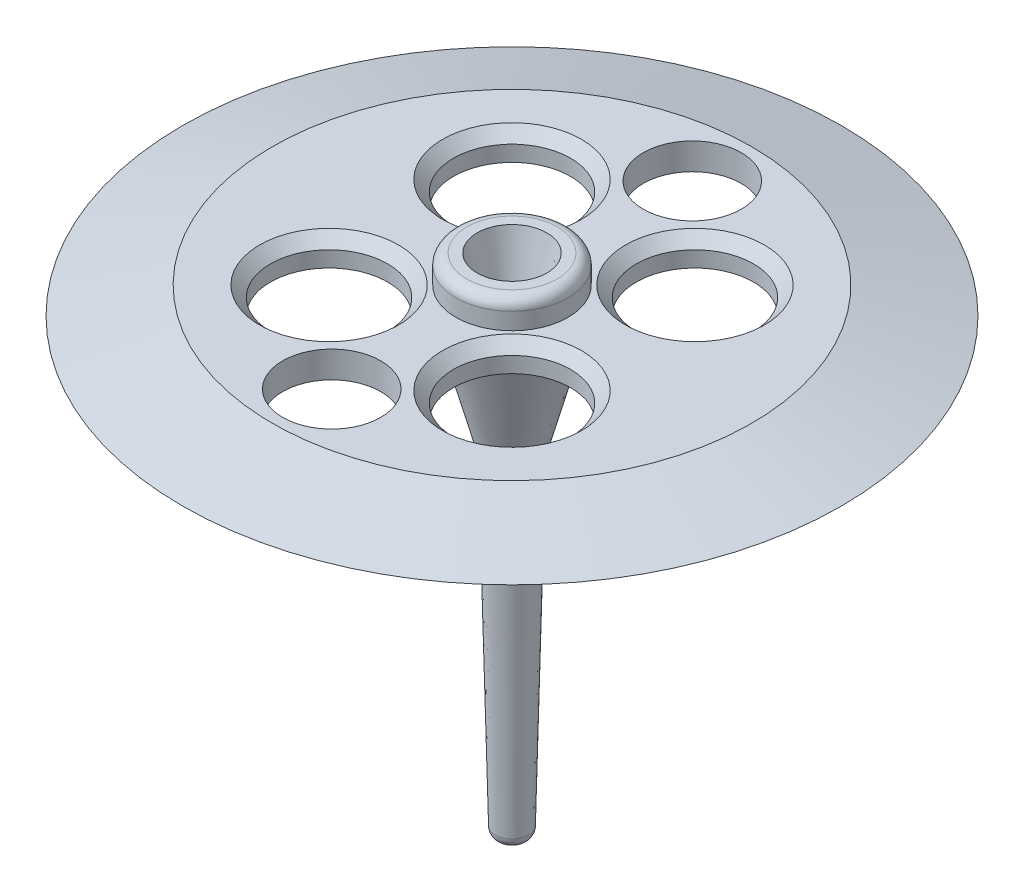
ISO-10303-21;
HEADER;
FILE_DESCRIPTION(('STEP AP214'),'2;1');
FILE_NAME('part.step','',(''),(''),'','','');
FILE_SCHEMA(('AUTOMOTIVE_DESIGN { 1 0 10303 214 1 1 1 1 }'));
ENDSEC;
DATA;
#1=APPLICATION_CONTEXT('core data for automotive mechanical design processes');
#2=APPLICATION_PROTOCOL_DEFINITION('international standard','automotive_design',2000,#1);
#3=PRODUCT_CONTEXT('',#1,'mechanical');
#4=PRODUCT('Part','Part','',(#3));
#5=PRODUCT_RELATED_PRODUCT_CATEGORY('part','',(#4));
#6=PRODUCT_DEFINITION_FORMATION('','',#4);
#7=PRODUCT_DEFINITION_CONTEXT('part definition',#1,'design');
#8=PRODUCT_DEFINITION('design','',#6,#7);
#9=PRODUCT_DEFINITION_SHAPE('','',#8);
#10=(LENGTH_UNIT() NAMED_UNIT(*) SI_UNIT(.MILLI.,.METRE.));
#11=(NAMED_UNIT(*) PLANE_ANGLE_UNIT() SI_UNIT($,.RADIAN.));
#12=(NAMED_UNIT(*) SI_UNIT($,.STERADIAN.) SOLID_ANGLE_UNIT());
#13=UNCERTAINTY_MEASURE_WITH_UNIT(LENGTH_MEASURE(1.E-05),#10,'distance_accuracy_value','');
#14=(GEOMETRIC_REPRESENTATION_CONTEXT(3) GLOBAL_UNCERTAINTY_ASSIGNED_CONTEXT((#13)) GLOBAL_UNIT_ASSIGNED_CONTEXT((#10,
#11,#12)) REPRESENTATION_CONTEXT('',''));
#15=CARTESIAN_POINT('',(0.,0.,0.));
#16=DIRECTION('',(0.,0.,1.));
#17=DIRECTION('',(1.,0.,0.));
#18=AXIS2_PLACEMENT_3D('',#15,#16,#17);
#19=CARTESIAN_POINT('',(0.,0.,0.));
#20=DIRECTION('',(0.,1.,0.));
#21=DIRECTION('',(0.,0.,1.));
#22=AXIS2_PLACEMENT_3D('',#19,#20,#21);
#23=CONICAL_SURFACE('',#22,5.15,0.262016417954227);
#24=CARTESIAN_POINT('',(0.,-10.8839918967392,0.));
#25=DIRECTION('',(0.,-1.,0.));
#26=DIRECTION('',(0.,0.,-1.));
#27=AXIS2_PLACEMENT_3D('',#24,#25,#26);
#28=CIRCLE('',#27,2.2311112640563);
#29=CARTESIAN_POINT('',(0.,-10.8839918967392,-2.2311112640563));
#30=VERTEX_POINT('',#29);
#31=EDGE_CURVE('E62',#30,#30,#28,.T.);
#32=ORIENTED_EDGE('',*,*,#31,.F.);
#33=EDGE_LOOP('',(#32));
#34=FACE_BOUND('',#33,.T.);
#35=CARTESIAN_POINT('',(0.,0.,0.));
#36=DIRECTION('',(0.,-1.,0.));
#37=DIRECTION('',(0.,0.,-1.));
#38=AXIS2_PLACEMENT_3D('',#35,#36,#37);
#39=CIRCLE('',#38,5.15);
#40=CARTESIAN_POINT('',(0.,0.,-5.15));
#41=VERTEX_POINT('',#40);
#42=EDGE_CURVE('E83',#41,#41,#39,.T.);
#43=ORIENTED_EDGE('',*,*,#42,.T.);
#44=EDGE_LOOP('',(#43));
#45=FACE_BOUND('',#44,.T.);
#46=ADVANCED_FACE('F30',(#34,#45),#23,.T.);
#47=CARTESIAN_POINT('',(0.,-11.1430205707765,0.));
#48=DIRECTION('',(0.,-1.,0.));
#49=DIRECTION('',(0.,0.,-1.));
#50=AXIS2_PLACEMENT_3D('',#47,#48,#49);
#51=TOROIDAL_SURFACE('',#50,3.19698089605975,1.);
#52=CARTESIAN_POINT('',(0.,-11.1200757932763,0.));
#53=DIRECTION('',(0.,-1.,0.));
#54=DIRECTION('',(0.,0.,-1.));
#55=AXIS2_PLACEMENT_3D('',#52,#53,#54);
#56=CIRCLE('',#55,2.19724416212153);
#57=CARTESIAN_POINT('',(0.,-11.1200757932763,-2.19724416212153));
#58=VERTEX_POINT('',#57);
#59=EDGE_CURVE('E86',#58,#58,#56,.T.);
#60=ORIENTED_EDGE('',*,*,#59,.F.);
#61=EDGE_LOOP('',(#60));
#62=FACE_BOUND('',#61,.T.);
#63=ORIENTED_EDGE('',*,*,#31,.T.);
#64=EDGE_LOOP('',(#63));
#65=FACE_BOUND('',#64,.T.);
#66=ADVANCED_FACE('F173',(#62,#65),#51,.F.);
#67=CARTESIAN_POINT('',(0.,-11.1200757932763,0.));
#68=DIRECTION('',(0.,1.,0.));
#69=DIRECTION('',(0.,0.,1.));
#70=AXIS2_PLACEMENT_3D('',#67,#68,#69);
#71=CONICAL_SURFACE('',#70,2.19724416212153,0.0229467912393531);
#72=CARTESIAN_POINT('',(0.,-40.5229447775002,0.));
#73=DIRECTION('',(0.,-1.,0.));
#74=DIRECTION('',(0.,0.,-1.));
#75=AXIS2_PLACEMENT_3D('',#72,#73,#74);
#76=CIRCLE('',#75,1.5224242182213);
#77=CARTESIAN_POINT('',(0.,-40.5229447775002,-1.5224242182213));
#78=VERTEX_POINT('',#77);
#79=EDGE_CURVE('E89',#78,#78,#76,.T.);
#80=ORIENTED_EDGE('',*,*,#79,.F.);
#81=EDGE_LOOP('',(#80));
#82=FACE_BOUND('',#81,.T.);
#83=ORIENTED_EDGE('',*,*,#59,.T.);
#84=EDGE_LOOP('',(#83));
#85=FACE_BOUND('',#84,.T.);
#86=ADVANCED_FACE('F179',(#82,#85),#71,.T.);
#87=CARTESIAN_POINT('',(0.,-40.5,0.));
#88=DIRECTION('',(0.,-1.,0.));
#89=DIRECTION('',(0.,0.,-1.));
#90=AXIS2_PLACEMENT_3D('',#87,#88,#89);
#91=DEGENERATE_TOROIDAL_SURFACE('',#90,0.522687484283084,0.999999999999997,.T.);
#92=CARTESIAN_POINT('',(0.,-41.5,0.));
#93=DIRECTION('',(0.,-1.,0.));
#94=DIRECTION('',(0.,0.,-1.));
#95=AXIS2_PLACEMENT_3D('',#92,#93,#94);
#96=CIRCLE('',#95,0.522687484283084);
#97=CARTESIAN_POINT('',(0.,-41.5,-0.522687484283084));
#98=VERTEX_POINT('',#97);
#99=EDGE_CURVE('E92',#98,#98,#96,.T.);
#100=ORIENTED_EDGE('',*,*,#99,.F.);
#101=EDGE_LOOP('',(#100));
#102=FACE_BOUND('',#101,.T.);
#103=ORIENTED_EDGE('',*,*,#79,.T.);
#104=EDGE_LOOP('',(#103));
#105=FACE_BOUND('',#104,.T.);
#106=ADVANCED_FACE('F169',(#102,#105),#91,.T.);
#107=CARTESIAN_POINT('',(-0.522687484283084,-41.5,0.));
#108=DIRECTION('',(0.,1.,0.));
#109=DIRECTION('',(0.,0.,1.));
#110=AXIS2_PLACEMENT_3D('',#107,#108,#109);
#111=PLANE('',#110);
#112=ORIENTED_EDGE('',*,*,#99,.T.);
#113=EDGE_LOOP('',(#112));
#114=FACE_BOUND('',#113,.T.);
#115=ADVANCED_FACE('F164',(#114),#111,.F.);
#116=CARTESIAN_POINT('',(-2.,0.,0.));
#117=DIRECTION('',(0.,-1.,0.));
#118=DIRECTION('',(0.,0.,-1.));
#119=AXIS2_PLACEMENT_3D('',#116,#117,#118);
#120=PLANE('',#119);
#121=CARTESIAN_POINT('',(0.,0.,0.));
#122=DIRECTION('',(0.,-1.,0.));
#123=DIRECTION('',(0.,0.,-1.));
#124=AXIS2_PLACEMENT_3D('',#121,#122,#123);
#125=CIRCLE('',#124,2.);
#126=CARTESIAN_POINT('',(0.,0.,-2.));
#127=VERTEX_POINT('',#126);
#128=EDGE_CURVE('E95',#127,#127,#125,.T.);
#129=ORIENTED_EDGE('',*,*,#128,.F.);
#130=EDGE_LOOP('',(#129));
#131=FACE_BOUND('',#130,.T.);
#132=ADVANCED_FACE('F159',(#131),#120,.F.);
#133=CARTESIAN_POINT('',(0.,0.,0.));
#134=DIRECTION('',(0.,1.,0.));
#135=DIRECTION('',(0.,0.,1.));
#136=AXIS2_PLACEMENT_3D('',#133,#134,#135);
#137=CONICAL_SURFACE('',#136,2.,0.234973967604444);
#138=CARTESIAN_POINT('',(0.,5.,0.));
#139=DIRECTION('',(0.,-1.,0.));
#140=DIRECTION('',(0.,0.,-1.));
#141=AXIS2_PLACEMENT_3D('',#138,#139,#140);
#142=CIRCLE('',#141,3.19698089605975);
#143=CARTESIAN_POINT('',(0.,5.,-3.19698089605975));
#144=VERTEX_POINT('',#143);
#145=EDGE_CURVE('E98',#144,#144,#142,.T.);
#146=ORIENTED_EDGE('',*,*,#145,.F.);
#147=EDGE_LOOP('',(#146));
#148=FACE_BOUND('',#147,.T.);
#149=ORIENTED_EDGE('',*,*,#128,.T.);
#150=EDGE_LOOP('',(#149));
#151=FACE_BOUND('',#150,.T.);
#152=ADVANCED_FACE('F153',(#148,#151),#137,.F.);
#153=CARTESIAN_POINT('',(-4.15,5.,0.));
#154=DIRECTION('',(0.,-1.,0.));
#155=DIRECTION('',(0.,0.,-1.));
#156=AXIS2_PLACEMENT_3D('',#153,#154,#155);
#157=PLANE('',#156);
#158=CARTESIAN_POINT('',(0.,5.,0.));
#159=DIRECTION('',(0.,-1.,0.));
#160=DIRECTION('',(0.,0.,-1.));
#161=AXIS2_PLACEMENT_3D('',#158,#159,#160);
#162=CIRCLE('',#161,4.15);
#163=CARTESIAN_POINT('',(0.,5.,-4.15));
#164=VERTEX_POINT('',#163);
#165=EDGE_CURVE('E101',#164,#164,#162,.T.);
#166=ORIENTED_EDGE('',*,*,#165,.F.);
#167=EDGE_LOOP('',(#166));
#168=FACE_BOUND('',#167,.T.);
#169=ORIENTED_EDGE('',*,*,#145,.T.);
#170=EDGE_LOOP('',(#169));
#171=FACE_BOUND('',#170,.T.);
#172=ADVANCED_FACE('F147',(#168,#171),#157,.F.);
#173=CARTESIAN_POINT('',(0.,4.,0.));
#174=DIRECTION('',(0.,-1.,0.));
#175=DIRECTION('',(0.,0.,-1.));
#176=AXIS2_PLACEMENT_3D('',#173,#174,#175);
#177=TOROIDAL_SURFACE('',#176,4.15,1.);
#178=CARTESIAN_POINT('',(0.,4.,0.));
#179=DIRECTION('',(0.,-1.,0.));
#180=DIRECTION('',(0.,0.,-1.));
#181=AXIS2_PLACEMENT_3D('',#178,#179,#180);
#182=CIRCLE('',#181,5.15);
#183=CARTESIAN_POINT('',(0.,4.,-5.15));
#184=VERTEX_POINT('',#183);
#185=EDGE_CURVE('E104',#184,#184,#182,.T.);
#186=ORIENTED_EDGE('',*,*,#185,.F.);
#187=EDGE_LOOP('',(#186));
#188=FACE_BOUND('',#187,.T.);
#189=ORIENTED_EDGE('',*,*,#165,.T.);
#190=EDGE_LOOP('',(#189));
#191=FACE_BOUND('',#190,.T.);
#192=ADVANCED_FACE('F141',(#188,#191),#177,.T.);
#193=CARTESIAN_POINT('',(0.,0.,0.));
#194=DIRECTION('',(0.,-1.,0.));
#195=DIRECTION('',(0.,0.,-1.));
#196=AXIS2_PLACEMENT_3D('',#193,#194,#195);
#197=CYLINDRICAL_SURFACE('',#196,5.15);
#198=CARTESIAN_POINT('',(0.,2.45,0.));
#199=DIRECTION('',(0.,-1.,0.));
#200=DIRECTION('',(0.,0.,-1.));
#201=AXIS2_PLACEMENT_3D('',#198,#199,#200);
#202=CIRCLE('',#201,5.15);
#203=CARTESIAN_POINT('',(0.,2.45,-5.15));
#204=VERTEX_POINT('',#203);
#205=EDGE_CURVE('E107',#204,#204,#202,.T.);
#206=ORIENTED_EDGE('',*,*,#205,.F.);
#207=EDGE_LOOP('',(#206));
#208=FACE_BOUND('',#207,.T.);
#209=ORIENTED_EDGE('',*,*,#185,.T.);
#210=EDGE_LOOP('',(#209));
#211=FACE_BOUND('',#210,.T.);
#212=ADVANCED_FACE('F130',(#208,#211),#197,.T.);
#213=CARTESIAN_POINT('',(-22.,2.45,0.));
#214=DIRECTION('',(0.,-1.,0.));
#215=DIRECTION('',(0.,0.,-1.));
#216=AXIS2_PLACEMENT_3D('',#213,#214,#215);
#217=PLANE('',#216);
#218=CARTESIAN_POINT('',(8.39689302659027,2.45,-8.39689302659024));
#219=DIRECTION('',(0.,-1.,0.));
#220=DIRECTION('',(0.,0.,-1.));
#221=AXIS2_PLACEMENT_3D('',#218,#219,#220);
#222=CIRCLE('',#221,6.375);
#223=CARTESIAN_POINT('',(8.39689302659027,2.45,-14.7718930265902));
#224=VERTEX_POINT('',#223);
#225=EDGE_CURVE('E45',#224,#224,#222,.T.);
#226=ORIENTED_EDGE('',*,*,#225,.T.);
#227=EDGE_LOOP('',(#226));
#228=FACE_BOUND('',#227,.T.);
#229=CARTESIAN_POINT('',(8.39689302659027,2.45,8.39689302659024));
#230=DIRECTION('',(0.,-1.,0.));
#231=DIRECTION('',(0.,0.,-1.));
#232=AXIS2_PLACEMENT_3D('',#229,#230,#231);
#233=CIRCLE('',#232,6.375);
#234=CARTESIAN_POINT('',(8.39689302659027,2.45,2.02189302659024));
#235=VERTEX_POINT('',#234);
#236=EDGE_CURVE('E50',#235,#235,#233,.T.);
#237=ORIENTED_EDGE('',*,*,#236,.T.);
#238=EDGE_LOOP('',(#237));
#239=FACE_BOUND('',#238,.T.);
#240=CARTESIAN_POINT('',(-8.39689302659027,2.45,8.39689302659024));
#241=DIRECTION('',(0.,-1.,0.));
#242=DIRECTION('',(0.,0.,-1.));
#243=AXIS2_PLACEMENT_3D('',#240,#241,#242);
#244=CIRCLE('',#243,6.375);
#245=CARTESIAN_POINT('',(-8.39689302659027,2.45,2.02189302659024));
#246=VERTEX_POINT('',#245);
#247=EDGE_CURVE('E53',#246,#246,#244,.T.);
#248=ORIENTED_EDGE('',*,*,#247,.T.);
#249=EDGE_LOOP('',(#248));
#250=FACE_BOUND('',#249,.T.);
#251=CARTESIAN_POINT('',(-8.39689302659027,2.45,-8.39689302659024));
#252=DIRECTION('',(0.,-1.,0.));
#253=DIRECTION('',(0.,0.,-1.));
#254=AXIS2_PLACEMENT_3D('',#251,#252,#253);
#255=CIRCLE('',#254,6.375);
#256=CARTESIAN_POINT('',(-8.39689302659027,2.45,-14.7718930265902));
#257=VERTEX_POINT('',#256);
#258=EDGE_CURVE('E56',#257,#257,#255,.T.);
#259=ORIENTED_EDGE('',*,*,#258,.T.);
#260=EDGE_LOOP('',(#259));
#261=FACE_BOUND('',#260,.T.);
#262=CARTESIAN_POINT('',(0.,2.45,16.55));
#263=DIRECTION('',(0.,1.,0.));
#264=DIRECTION('',(0.,0.,-1.));
#265=AXIS2_PLACEMENT_3D('',#262,#263,#264);
#266=CIRCLE('',#265,4.5);
#267=CARTESIAN_POINT('',(0.,2.45,12.05));
#268=VERTEX_POINT('',#267);
#269=EDGE_CURVE('E66',#268,#268,#266,.T.);
#270=ORIENTED_EDGE('',*,*,#269,.F.);
#271=EDGE_LOOP('',(#270));
#272=FACE_BOUND('',#271,.T.);
#273=CARTESIAN_POINT('',(0.,2.45,-16.55));
#274=DIRECTION('',(0.,1.,0.));
#275=DIRECTION('',(0.,0.,1.));
#276=AXIS2_PLACEMENT_3D('',#273,#274,#275);
#277=CIRCLE('',#276,4.5);
#278=CARTESIAN_POINT('',(0.,2.45,-12.05));
#279=VERTEX_POINT('',#278);
#280=EDGE_CURVE('E70',#279,#279,#277,.T.);
#281=ORIENTED_EDGE('',*,*,#280,.F.);
#282=EDGE_LOOP('',(#281));
#283=FACE_BOUND('',#282,.T.);
#284=CARTESIAN_POINT('',(0.,2.45,0.));
#285=DIRECTION('',(0.,-1.,0.));
#286=DIRECTION('',(0.,0.,-1.));
#287=AXIS2_PLACEMENT_3D('',#284,#285,#286);
#288=CIRCLE('',#287,22.);
#289=CARTESIAN_POINT('',(0.,2.45,-22.));
#290=VERTEX_POINT('',#289);
#291=EDGE_CURVE('E110',#290,#290,#288,.T.);
#292=ORIENTED_EDGE('',*,*,#291,.F.);
#293=EDGE_LOOP('',(#292));
#294=FACE_BOUND('',#293,.T.);
#295=ORIENTED_EDGE('',*,*,#205,.T.);
#296=EDGE_LOOP('',(#295));
#297=FACE_BOUND('',#296,.T.);
#298=ADVANCED_FACE('F126',(#228,#239,#250,#261,#272,#283,#294,#297),#217,.F.);
#299=CARTESIAN_POINT('',(0.,2.45,0.));
#300=DIRECTION('',(0.,-1.,0.));
#301=DIRECTION('',(0.,0.,-1.));
#302=AXIS2_PLACEMENT_3D('',#299,#300,#301);
#303=CONICAL_SURFACE('',#302,22.,1.28212194027307);
#304=CARTESIAN_POINT('',(0.,0.,0.));
#305=DIRECTION('',(0.,-1.,0.));
#306=DIRECTION('',(0.,0.,-1.));
#307=AXIS2_PLACEMENT_3D('',#304,#305,#306);
#308=CIRCLE('',#307,30.25);
#309=CARTESIAN_POINT('',(0.,0.,-30.25));
#310=VERTEX_POINT('',#309);
#311=EDGE_CURVE('E113',#310,#310,#308,.T.);
#312=ORIENTED_EDGE('',*,*,#311,.F.);
#313=EDGE_LOOP('',(#312));
#314=FACE_BOUND('',#313,.T.);
#315=ORIENTED_EDGE('',*,*,#291,.T.);
#316=EDGE_LOOP('',(#315));
#317=FACE_BOUND('',#316,.T.);
#318=ADVANCED_FACE('F129',(#314,#317),#303,.T.);
#319=CARTESIAN_POINT('',(-5.15,0.,0.));
#320=DIRECTION('',(0.,1.,0.));
#321=DIRECTION('',(0.,0.,1.));
#322=AXIS2_PLACEMENT_3D('',#319,#320,#321);
#323=PLANE('',#322);
#324=CARTESIAN_POINT('',(-8.39689302659027,0.,8.39689302659024));
#325=DIRECTION('',(0.,1.,0.));
#326=DIRECTION('',(0.,0.,1.));
#327=AXIS2_PLACEMENT_3D('',#324,#325,#326);
#328=CIRCLE('',#327,5.375);
#329=CARTESIAN_POINT('',(-8.39689302659027,0.,13.7718930265902));
#330=VERTEX_POINT('',#329);
#331=EDGE_CURVE('E63',#330,#330,#328,.T.);
#332=ORIENTED_EDGE('',*,*,#331,.T.);
#333=EDGE_LOOP('',(#332));
#334=FACE_BOUND('',#333,.T.);
#335=CARTESIAN_POINT('',(0.,0.,16.55));
#336=DIRECTION('',(0.,1.,0.));
#337=DIRECTION('',(0.,0.,1.));
#338=AXIS2_PLACEMENT_3D('',#335,#336,#337);
#339=CIRCLE('',#338,4.5);
#340=CARTESIAN_POINT('',(0.,0.,21.05));
#341=VERTEX_POINT('',#340);
#342=EDGE_CURVE('E67',#341,#341,#339,.T.);
#343=ORIENTED_EDGE('',*,*,#342,.T.);
#344=EDGE_LOOP('',(#343));
#345=FACE_BOUND('',#344,.T.);
#346=CARTESIAN_POINT('',(0.,0.,-16.55));
#347=DIRECTION('',(0.,1.,0.));
#348=DIRECTION('',(0.,0.,1.));
#349=AXIS2_PLACEMENT_3D('',#346,#347,#348);
#350=CIRCLE('',#349,4.5);
#351=CARTESIAN_POINT('',(0.,0.,-12.05));
#352=VERTEX_POINT('',#351);
#353=EDGE_CURVE('E71',#352,#352,#350,.T.);
#354=ORIENTED_EDGE('',*,*,#353,.T.);
#355=EDGE_LOOP('',(#354));
#356=FACE_BOUND('',#355,.T.);
#357=CARTESIAN_POINT('',(8.39689302659027,0.,-8.39689302659024));
#358=DIRECTION('',(0.,1.,0.));
#359=DIRECTION('',(0.,0.,1.));
#360=AXIS2_PLACEMENT_3D('',#357,#358,#359);
#361=CIRCLE('',#360,5.375);
#362=CARTESIAN_POINT('',(8.39689302659027,0.,-3.02189302659024));
#363=VERTEX_POINT('',#362);
#364=EDGE_CURVE('E74',#363,#363,#361,.T.);
#365=ORIENTED_EDGE('',*,*,#364,.T.);
#366=EDGE_LOOP('',(#365));
#367=FACE_BOUND('',#366,.T.);
#368=CARTESIAN_POINT('',(8.39689302659027,0.,8.39689302659024));
#369=DIRECTION('',(0.,1.,0.));
#370=DIRECTION('',(0.,0.,1.));
#371=AXIS2_PLACEMENT_3D('',#368,#369,#370);
#372=CIRCLE('',#371,5.375);
#373=CARTESIAN_POINT('',(8.39689302659027,0.,13.7718930265902));
#374=VERTEX_POINT('',#373);
#375=EDGE_CURVE('E77',#374,#374,#372,.T.);
#376=ORIENTED_EDGE('',*,*,#375,.T.);
#377=EDGE_LOOP('',(#376));
#378=FACE_BOUND('',#377,.T.);
#379=CARTESIAN_POINT('',(-8.39689302659027,0.,-8.39689302659024));
#380=DIRECTION('',(0.,1.,0.));
#381=DIRECTION('',(0.,0.,1.));
#382=AXIS2_PLACEMENT_3D('',#379,#380,#381);
#383=CIRCLE('',#382,5.375);
#384=CARTESIAN_POINT('',(-8.39689302659027,0.,-3.02189302659024));
#385=VERTEX_POINT('',#384);
#386=EDGE_CURVE('E80',#385,#385,#383,.T.);
#387=ORIENTED_EDGE('',*,*,#386,.T.);
#388=EDGE_LOOP('',(#387));
#389=FACE_BOUND('',#388,.T.);
#390=ORIENTED_EDGE('',*,*,#42,.F.);
#391=EDGE_LOOP('',(#390));
#392=FACE_BOUND('',#391,.T.);
#393=ORIENTED_EDGE('',*,*,#311,.T.);
#394=EDGE_LOOP('',(#393));
#395=FACE_BOUND('',#394,.T.);
#396=ADVANCED_FACE('F268',(#334,#345,#356,#367,#378,#389,#392,#395),#323,.F.);
#397=CARTESIAN_POINT('',(-8.39689302659027,-41.5,-8.39689302659024));
#398=DIRECTION('',(0.,1.,0.));
#399=DIRECTION('',(0.,0.,1.));
#400=AXIS2_PLACEMENT_3D('',#397,#398,#399);
#401=CYLINDRICAL_SURFACE('',#400,5.375);
#402=CARTESIAN_POINT('',(-8.39689302659027,1.45,-8.39689302659024));
#403=DIRECTION('',(0.,-1.,0.));
#404=DIRECTION('',(0.,0.,-1.));
#405=AXIS2_PLACEMENT_3D('',#402,#403,#404);
#406=CIRCLE('',#405,5.375);
#407=CARTESIAN_POINT('',(-8.39689302659027,1.45,-13.7718930265902));
#408=VERTEX_POINT('',#407);
#409=EDGE_CURVE('E10',#408,#408,#406,.F.);
#410=ORIENTED_EDGE('',*,*,#409,.T.);
#411=EDGE_LOOP('',(#410));
#412=FACE_BOUND('',#411,.T.);
#413=ORIENTED_EDGE('',*,*,#386,.F.);
#414=EDGE_LOOP('',(#413));
#415=FACE_BOUND('',#414,.T.);
#416=ADVANCED_FACE('F258',(#412,#415),#401,.F.);
#417=CARTESIAN_POINT('',(8.39689302659027,-41.5,8.39689302659024));
#418=DIRECTION('',(0.,1.,0.));
#419=DIRECTION('',(0.,0.,1.));
#420=AXIS2_PLACEMENT_3D('',#417,#418,#419);
#421=CYLINDRICAL_SURFACE('',#420,5.375);
#422=CARTESIAN_POINT('',(8.39689302659027,1.45,8.39689302659024));
#423=DIRECTION('',(0.,-1.,0.));
#424=DIRECTION('',(0.,0.,-1.));
#425=AXIS2_PLACEMENT_3D('',#422,#423,#424);
#426=CIRCLE('',#425,5.375);
#427=CARTESIAN_POINT('',(8.39689302659027,1.45,3.02189302659024));
#428=VERTEX_POINT('',#427);
#429=EDGE_CURVE('E41',#428,#428,#426,.F.);
#430=ORIENTED_EDGE('',*,*,#429,.T.);
#431=EDGE_LOOP('',(#430));
#432=FACE_BOUND('',#431,.T.);
#433=ORIENTED_EDGE('',*,*,#375,.F.);
#434=EDGE_LOOP('',(#433));
#435=FACE_BOUND('',#434,.T.);
#436=ADVANCED_FACE('F246',(#432,#435),#421,.F.);
#437=CARTESIAN_POINT('',(8.39689302659027,-41.5,-8.39689302659024));
#438=DIRECTION('',(0.,1.,0.));
#439=DIRECTION('',(0.,0.,1.));
#440=AXIS2_PLACEMENT_3D('',#437,#438,#439);
#441=CYLINDRICAL_SURFACE('',#440,5.375);
#442=CARTESIAN_POINT('',(8.39689302659027,1.45,-8.39689302659024));
#443=DIRECTION('',(0.,-1.,0.));
#444=DIRECTION('',(0.,0.,-1.));
#445=AXIS2_PLACEMENT_3D('',#442,#443,#444);
#446=CIRCLE('',#445,5.375);
#447=CARTESIAN_POINT('',(8.39689302659027,1.45,-13.7718930265902));
#448=VERTEX_POINT('',#447);
#449=EDGE_CURVE('E59',#448,#448,#446,.F.);
#450=ORIENTED_EDGE('',*,*,#449,.T.);
#451=EDGE_LOOP('',(#450));
#452=FACE_BOUND('',#451,.T.);
#453=ORIENTED_EDGE('',*,*,#364,.F.);
#454=EDGE_LOOP('',(#453));
#455=FACE_BOUND('',#454,.T.);
#456=ADVANCED_FACE('F240',(#452,#455),#441,.F.);
#457=CARTESIAN_POINT('',(0.,-41.5,-16.55));
#458=DIRECTION('',(0.,1.,0.));
#459=DIRECTION('',(0.,0.,1.));
#460=AXIS2_PLACEMENT_3D('',#457,#458,#459);
#461=CYLINDRICAL_SURFACE('',#460,4.5);
#462=ORIENTED_EDGE('',*,*,#280,.T.);
#463=EDGE_LOOP('',(#462));
#464=FACE_BOUND('',#463,.T.);
#465=ORIENTED_EDGE('',*,*,#353,.F.);
#466=EDGE_LOOP('',(#465));
#467=FACE_BOUND('',#466,.T.);
#468=ADVANCED_FACE('F245',(#464,#467),#461,.F.);
#469=CARTESIAN_POINT('',(0.,-41.5,16.55));
#470=DIRECTION('',(0.,1.,0.));
#471=DIRECTION('',(0.,0.,1.));
#472=AXIS2_PLACEMENT_3D('',#469,#470,#471);
#473=CYLINDRICAL_SURFACE('',#472,4.5);
#474=ORIENTED_EDGE('',*,*,#269,.T.);
#475=EDGE_LOOP('',(#474));
#476=FACE_BOUND('',#475,.T.);
#477=ORIENTED_EDGE('',*,*,#342,.F.);
#478=EDGE_LOOP('',(#477));
#479=FACE_BOUND('',#478,.T.);
#480=ADVANCED_FACE('F123',(#476,#479),#473,.F.);
#481=CARTESIAN_POINT('',(-8.39689302659027,-41.5,8.39689302659024));
#482=DIRECTION('',(0.,1.,0.));
#483=DIRECTION('',(0.,0.,1.));
#484=AXIS2_PLACEMENT_3D('',#481,#482,#483);
#485=CYLINDRICAL_SURFACE('',#484,5.375);
#486=CARTESIAN_POINT('',(-8.39689302659027,1.45,8.39689302659024));
#487=DIRECTION('',(0.,-1.,0.));
#488=DIRECTION('',(0.,0.,-1.));
#489=AXIS2_PLACEMENT_3D('',#486,#487,#488);
#490=CIRCLE('',#489,5.375);
#491=CARTESIAN_POINT('',(-8.39689302659027,1.45,3.02189302659024));
#492=VERTEX_POINT('',#491);
#493=EDGE_CURVE('E37',#492,#492,#490,.F.);
#494=ORIENTED_EDGE('',*,*,#493,.T.);
#495=EDGE_LOOP('',(#494));
#496=FACE_BOUND('',#495,.T.);
#497=ORIENTED_EDGE('',*,*,#331,.F.);
#498=EDGE_LOOP('',(#497));
#499=FACE_BOUND('',#498,.T.);
#500=ADVANCED_FACE('F190',(#496,#499),#485,.F.);
#501=CARTESIAN_POINT('',(8.39689302659027,1.45,-8.39689302659024));
#502=DIRECTION('',(0.,1.,0.));
#503=DIRECTION('',(0.,0.,1.));
#504=AXIS2_PLACEMENT_3D('',#501,#502,#503);
#505=CONICAL_SURFACE('',#504,5.375,0.785398163397451);
#506=ORIENTED_EDGE('',*,*,#225,.F.);
#507=EDGE_LOOP('',(#506));
#508=FACE_BOUND('',#507,.T.);
#509=ORIENTED_EDGE('',*,*,#449,.F.);
#510=EDGE_LOOP('',(#509));
#511=FACE_BOUND('',#510,.T.);
#512=ADVANCED_FACE('F186',(#508,#511),#505,.F.);
#513=CARTESIAN_POINT('',(8.39689302659027,1.45,8.39689302659024));
#514=DIRECTION('',(0.,1.,0.));
#515=DIRECTION('',(0.,0.,1.));
#516=AXIS2_PLACEMENT_3D('',#513,#514,#515);
#517=CONICAL_SURFACE('',#516,5.375,0.785398163397451);
#518=ORIENTED_EDGE('',*,*,#236,.F.);
#519=EDGE_LOOP('',(#518));
#520=FACE_BOUND('',#519,.T.);
#521=ORIENTED_EDGE('',*,*,#429,.F.);
#522=EDGE_LOOP('',(#521));
#523=FACE_BOUND('',#522,.T.);
#524=ADVANCED_FACE('F189',(#520,#523),#517,.F.);
#525=CARTESIAN_POINT('',(-8.39689302659027,1.45,8.39689302659024));
#526=DIRECTION('',(0.,1.,0.));
#527=DIRECTION('',(0.,0.,1.));
#528=AXIS2_PLACEMENT_3D('',#525,#526,#527);
#529=CONICAL_SURFACE('',#528,5.375,0.785398163397451);
#530=ORIENTED_EDGE('',*,*,#247,.F.);
#531=EDGE_LOOP('',(#530));
#532=FACE_BOUND('',#531,.T.);
#533=ORIENTED_EDGE('',*,*,#493,.F.);
#534=EDGE_LOOP('',(#533));
#535=FACE_BOUND('',#534,.T.);
#536=ADVANCED_FACE('F193',(#532,#535),#529,.F.);
#537=CARTESIAN_POINT('',(-8.39689302659027,1.45,-8.39689302659024));
#538=DIRECTION('',(0.,1.,0.));
#539=DIRECTION('',(0.,0.,1.));
#540=AXIS2_PLACEMENT_3D('',#537,#538,#539);
#541=CONICAL_SURFACE('',#540,5.375,0.785398163397451);
#542=ORIENTED_EDGE('',*,*,#258,.F.);
#543=EDGE_LOOP('',(#542));
#544=FACE_BOUND('',#543,.T.);
#545=ORIENTED_EDGE('',*,*,#409,.F.);
#546=EDGE_LOOP('',(#545));
#547=FACE_BOUND('',#546,.T.);
#548=ADVANCED_FACE('F32',(#544,#547),#541,.F.);
#549=CLOSED_SHELL('',(#46,#66,#86,#106,#115,#132,#152,#172,#192,#212,#298,#318,#396,#416,#436,
#456,#468,#480,#500,#512,#524,#536,#548));
#550=MANIFOLD_SOLID_BREP('B2',#549);
#551=ADVANCED_BREP_SHAPE_REPRESENTATION('',(#18,#550),#14);
#552=SHAPE_DEFINITION_REPRESENTATION(#9,#551);
ENDSEC;
END-ISO-10303-21;
